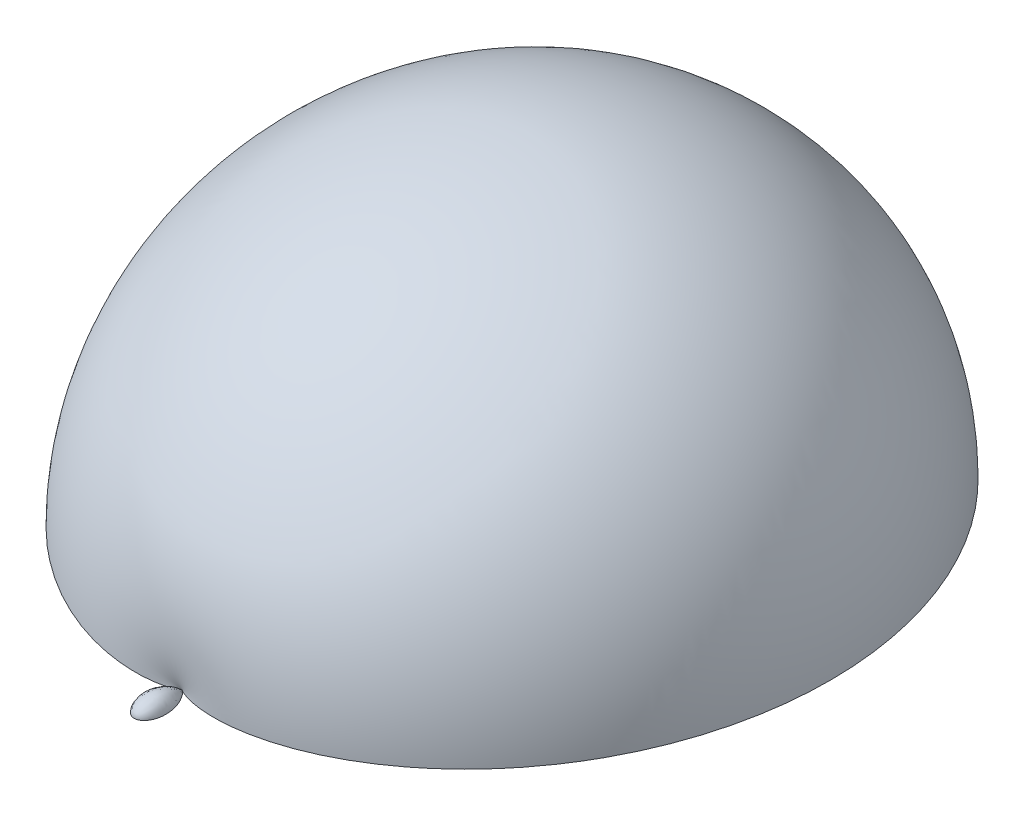
ISO-10303-21;
HEADER;
FILE_DESCRIPTION(('STEP AP214'),'2;1');
FILE_NAME('part.step','',(''),(''),'','','');
FILE_SCHEMA(('AUTOMOTIVE_DESIGN { 1 0 10303 214 1 1 1 1 }'));
ENDSEC;
DATA;
#1=APPLICATION_CONTEXT('core data for automotive mechanical design processes');
#2=APPLICATION_PROTOCOL_DEFINITION('international standard','automotive_design',2000,#1);
#3=PRODUCT_CONTEXT('',#1,'mechanical');
#4=PRODUCT('Part','Part','',(#3));
#5=PRODUCT_RELATED_PRODUCT_CATEGORY('part','',(#4));
#6=PRODUCT_DEFINITION_FORMATION('','',#4);
#7=PRODUCT_DEFINITION_CONTEXT('part definition',#1,'design');
#8=PRODUCT_DEFINITION('design','',#6,#7);
#9=PRODUCT_DEFINITION_SHAPE('','',#8);
#10=(LENGTH_UNIT() NAMED_UNIT(*) SI_UNIT(.MILLI.,.METRE.));
#11=(NAMED_UNIT(*) PLANE_ANGLE_UNIT() SI_UNIT($,.RADIAN.));
#12=(NAMED_UNIT(*) SI_UNIT($,.STERADIAN.) SOLID_ANGLE_UNIT());
#13=UNCERTAINTY_MEASURE_WITH_UNIT(LENGTH_MEASURE(1.E-05),#10,'distance_accuracy_value','');
#14=(GEOMETRIC_REPRESENTATION_CONTEXT(3) GLOBAL_UNCERTAINTY_ASSIGNED_CONTEXT((#13)) GLOBAL_UNIT_ASSIGNED_CONTEXT((#10,
#11,#12)) REPRESENTATION_CONTEXT('',''));
#15=CARTESIAN_POINT('',(0.,0.,0.));
#16=DIRECTION('',(0.,0.,1.));
#17=DIRECTION('',(1.,0.,0.));
#18=AXIS2_PLACEMENT_3D('',#15,#16,#17);
#19=CARTESIAN_POINT('',(3.06028735858265E-13,0.,21.3227192364473));
#20=CARTESIAN_POINT('',(-0.0605600851372698,0.,21.3227192364473));
#21=CARTESIAN_POINT('',(-0.180524470848123,0.,21.3196416488283));
#22=CARTESIAN_POINT('',(-0.367253435553289,0.,21.3081007327531));
#23=CARTESIAN_POINT('',(-0.555099954305753,0.,21.2828538482068));
#24=CARTESIAN_POINT('',(-0.716031376089089,0.,21.2543544839529));
#25=CARTESIAN_POINT('',(-0.844484831998398,0.,21.2271460866288));
#26=CARTESIAN_POINT('',(-1.00384668062234,0.,21.1877226172179));
#27=CARTESIAN_POINT('',(-1.19225597834348,0.,21.1319306277739));
#28=CARTESIAN_POINT('',(-1.40986644893566,0.,21.0543856421346));
#29=CARTESIAN_POINT('',(-1.65358201661449,0.,20.9495379866468));
#30=CARTESIAN_POINT('',(-1.91954629545271,0.,20.8149898556674));
#31=CARTESIAN_POINT('',(-2.20381439490061,0.,20.6455348772837));
#32=CARTESIAN_POINT('',(-2.50037552064583,0.,20.4374653876274));
#33=CARTESIAN_POINT('',(-2.80407151518409,0.,20.187245640245));
#34=CARTESIAN_POINT('',(-3.16020470363246,0.,19.8480703849216));
#35=CARTESIAN_POINT('',(-3.55002285408261,0.,19.404299117935));
#36=CARTESIAN_POINT('',(-3.95126616854423,0.,18.8437311144077));
#37=CARTESIAN_POINT('',(-4.43664961336897,0.,17.9905573006489));
#38=CARTESIAN_POINT('',(-4.89148726452149,0.,16.9017870305576));
#39=CARTESIAN_POINT('',(-5.25626167174152,0.,15.5734800440547));
#40=CARTESIAN_POINT('',(-5.47630484215257,0.,14.0155820653388));
#41=CARTESIAN_POINT('',(-5.52275474623004,0.,12.4409072350932));
#42=CARTESIAN_POINT('',(-5.41325463368996,0.,10.8698472301707));
#43=CARTESIAN_POINT('',(-5.1614088415779,0.,9.31556741862959));
#44=CARTESIAN_POINT('',(-4.777436955626,0.,7.78873548428225));
#45=CARTESIAN_POINT('',(-4.26875583085814,0.,6.29890695017353));
#46=CARTESIAN_POINT('',(-3.64033929904608,0.,4.85548320022228));
#47=CARTESIAN_POINT('',(-2.89456999099136,0.,3.46893515665885));
#48=CARTESIAN_POINT('',(-2.14256222285628,0.,2.32283287604823));
#49=CARTESIAN_POINT('',(-1.42614440038181,0.,1.40222976444919));
#50=CARTESIAN_POINT('',(-0.851142921162116,0.,0.768816275465535));
#51=CARTESIAN_POINT('',(-0.462580630449086,0.,0.387077097571633));
#52=CARTESIAN_POINT('',(-0.195923126656698,0.,0.152384324671856));
#53=CARTESIAN_POINT('',(-0.0663117351554884,0.,0.0495330631106812));
#54=CARTESIAN_POINT('',(0.,0.,0.));
#55=B_SPLINE_CURVE_WITH_KNOTS('',4,(#19,#20,#21,#22,#23,#24,#25,#26,#27,#28,#29,#30,#31,#32,#33,
#34,#35,#36,#37,#38,#39,#40,#41,#42,#43,#44,#45,#46,#47,#48,#49,#50,#51,#52,#53,#54),
.UNSPECIFIED.,.F.,.F.,(5,1,1,1,1,1,1,1,1,1,1,1,1,1,1,1,1,1,1,1,1,1,1,1,1,1,1,1,1,1,1,1,5),
(0.075727273648214,0.0852251902132587,0.0947231067783033,0.0994720692332456,0.104221031688188,
0.10896999414313,0.113718956598072,0.123216879822465,0.132714803046858,0.142432647675104,
0.15215049230335,0.166397447324557,0.180644402345764,0.194891233087148,0.209138063828531,
0.237631810695735,0.266125767747669,0.294619399363612,0.351197461360832,0.408185109509772,
0.465172649296407,0.522160251464682,0.579147822960017,0.636135418479735,0.693122967885307,
0.750110545802865,0.807098279092534,0.864085824216971,0.921073538054691,0.948543207210811,
0.97601287636693,0.988006438183465,1.),.UNSPECIFIED.);
#56=CARTESIAN_POINT('',(0.,0.,0.));
#57=DIRECTION('',(0.,0.,-1.));
#58=AXIS1_PLACEMENT('',#56,#57);
#59=SURFACE_OF_REVOLUTION('',#55,#58);
#60=CARTESIAN_POINT('',(-1.59744263229573E-13,0.,21.3227192364473));
#61=CARTESIAN_POINT('',(0.0605600851374161,0.,21.3227192364473));
#62=CARTESIAN_POINT('',(0.18052447084827,0.,21.3196416488283));
#63=CARTESIAN_POINT('',(0.367253435553436,0.,21.3081007327531));
#64=CARTESIAN_POINT('',(0.555099954305899,0.,21.2828538482068));
#65=CARTESIAN_POINT('',(0.716031376089234,0.,21.2543544839529));
#66=CARTESIAN_POINT('',(0.844484831998543,0.,21.2271460866288));
#67=CARTESIAN_POINT('',(1.00384668062249,0.,21.1877226172179));
#68=CARTESIAN_POINT('',(1.19225597834363,0.,21.1319306277738));
#69=CARTESIAN_POINT('',(1.40986644893581,0.,21.0543856421346));
#70=CARTESIAN_POINT('',(1.65358201661464,0.,20.9495379866467));
#71=CARTESIAN_POINT('',(1.91954629545285,0.,20.8149898556674));
#72=CARTESIAN_POINT('',(2.20381439490075,0.,20.6455348772837));
#73=CARTESIAN_POINT('',(2.50037552064597,0.,20.4374653876273));
#74=CARTESIAN_POINT('',(2.80407151518423,0.,20.187245640245));
#75=CARTESIAN_POINT('',(3.16020470363259,0.,19.8480703849216));
#76=CARTESIAN_POINT('',(3.55002285408275,0.,19.404299117935));
#77=CARTESIAN_POINT('',(3.95126616854436,0.,18.8437311144076));
#78=CARTESIAN_POINT('',(4.43664961336909,0.,17.9905573006488));
#79=CARTESIAN_POINT('',(4.89148726452161,0.,16.9017870305576));
#80=CARTESIAN_POINT('',(5.25626167174163,0.,15.5734800440547));
#81=CARTESIAN_POINT('',(5.47630484215267,0.,14.0155820653388));
#82=CARTESIAN_POINT('',(5.52275474623012,0.,12.4409072350931));
#83=CARTESIAN_POINT('',(5.41325463369003,0.,10.8698472301706));
#84=CARTESIAN_POINT('',(5.16140884157796,0.,9.31556741862955));
#85=CARTESIAN_POINT('',(4.77743695562606,0.,7.78873548428222));
#86=CARTESIAN_POINT('',(4.26875583085819,0.,6.2989069501735));
#87=CARTESIAN_POINT('',(3.64033929904611,0.,4.85548320022225));
#88=CARTESIAN_POINT('',(2.89456999099139,0.,3.46893515665883));
#89=CARTESIAN_POINT('',(2.1425622228563,0.,2.32283287604821));
#90=CARTESIAN_POINT('',(1.42614440038182,0.,1.40222976444918));
#91=CARTESIAN_POINT('',(0.851142921162121,0.,0.768816275465529));
#92=CARTESIAN_POINT('',(0.462580630449089,0.,0.387077097571629));
#93=CARTESIAN_POINT('',(0.195923126656699,0.,0.152384324671855));
#94=CARTESIAN_POINT('',(0.0663117351554888,0.,0.0495330631106807));
#95=CARTESIAN_POINT('',(0.,0.,0.));
#96=B_SPLINE_CURVE_WITH_KNOTS('',4,(#60,#61,#62,#63,#64,#65,#66,#67,#68,#69,#70,#71,#72,#73,#74,
#75,#76,#77,#78,#79,#80,#81,#82,#83,#84,#85,#86,#87,#88,#89,#90,#91,#92,#93,#94,#95),
.UNSPECIFIED.,.F.,.F.,(5,1,1,1,1,1,1,1,1,1,1,1,1,1,1,1,1,1,1,1,1,1,1,1,1,1,1,1,1,1,1,1,5),
(0.075727273648214,0.0852251902132587,0.0947231067783033,0.0994720692332456,0.104221031688188,
0.10896999414313,0.113718956598072,0.123216879822465,0.132714803046858,0.142432647675104,
0.15215049230335,0.166397447324557,0.180644402345764,0.194891233087148,0.209138063828531,
0.237631810695735,0.266125767747669,0.294619399363612,0.351197461360832,0.408185109509772,
0.465172649296407,0.522160251464682,0.579147822960017,0.636135418479735,0.693122967885307,
0.750110545802865,0.807098279092534,0.864085824216971,0.921073538054691,0.948543207210811,
0.97601287636693,0.988006438183465,1.),.UNSPECIFIED.);
#97=CARTESIAN_POINT('',(1.4497883263559E-13,0.,21.3227192364473));
#98=VERTEX_POINT('',#97);
#99=CARTESIAN_POINT('',(0.,0.,0.));
#100=VERTEX_POINT('',#99);
#101=EDGE_CURVE('P0_E27',#98,#100,#96,.T.);
#102=ORIENTED_EDGE('',*,*,#101,.T.);
#103=EDGE_CURVE('P0_E11',#98,#100,#55,.T.);
#104=ORIENTED_EDGE('',*,*,#103,.F.);
#105=EDGE_LOOP('',(#102,#104));
#106=FACE_BOUND('',#105,.T.);
#107=ADVANCED_FACE('P0_F17',(#106),#59,.T.);
#108=CARTESIAN_POINT('',(-5.42041091230144,0.,11.2243457893201));
#109=DIRECTION('',(0.,1.,0.));
#110=DIRECTION('',(0.,0.,-1.));
#111=AXIS2_PLACEMENT_3D('',#108,#109,#110);
#112=PLANE('',#111);
#113=ORIENTED_EDGE('',*,*,#103,.T.);
#114=ORIENTED_EDGE('',*,*,#101,.F.);
#115=EDGE_LOOP('',(#113,#114));
#116=FACE_BOUND('',#115,.T.);
#117=ADVANCED_FACE('P0_F34',(#116),#112,.F.);
#118=CLOSED_SHELL('',(#107,#117));
#119=MANIFOLD_SOLID_BREP('P0_B1',#118);
#120=CARTESIAN_POINT('',(2.07386554913813E-12,0.,0.));
#121=CARTESIAN_POINT('',(-0.0479863208393457,0.,0.0321703262097624));
#122=CARTESIAN_POINT('',(-0.145134861787362,0.,0.0946417333582184));
#123=CARTESIAN_POINT('',(-0.344202177756289,0.,0.212012112728412));
#124=CARTESIAN_POINT('',(-0.649410607301891,0.,0.376321721449868));
#125=CARTESIAN_POINT('',(-1.01178827318737,0.,0.555730005310857));
#126=CARTESIAN_POINT('',(-1.43242484901607,0.,0.747093766717329));
#127=CARTESIAN_POINT('',(-1.8580310883749,0.,0.927038839520863));
#128=CARTESIAN_POINT('',(-2.39525808021264,0.,1.1392078014803));
#129=CARTESIAN_POINT('',(-3.05778948779468,0.,1.3793736094263));
#130=CARTESIAN_POINT('',(-3.84838735570272,0.,1.63802458522609));
#131=CARTESIAN_POINT('',(-5.00215548509229,0.,1.97326411091218));
#132=CARTESIAN_POINT('',(-6.41543920888815,0.,2.32276693782154));
#133=CARTESIAN_POINT('',(-8.08061631008433,0.,2.65812280227645));
#134=CARTESIAN_POINT('',(-10.0715697689984,0.,2.96538096190314));
#135=CARTESIAN_POINT('',(-12.1467731358893,0.,3.19521110168923));
#136=CARTESIAN_POINT('',(-14.3027932474081,0.,3.345727050951));
#137=CARTESIAN_POINT('',(-16.5362981719592,-1.1547235296189E-13,3.41472517118743));
#138=CARTESIAN_POINT('',(-19.7079432041989,-1.37619831848889E-13,3.39857422575522));
#139=CARTESIAN_POINT('',(-23.0648185664982,-1.6106076721747E-13,3.20532305357224));
#140=CARTESIAN_POINT('',(-26.59557673471,-1.85715919730028E-13,2.82286693544886));
#141=CARTESIAN_POINT('',(-30.2890453566026,-2.1150727326791E-13,2.23743411660248));
#142=CARTESIAN_POINT('',(-33.2255239502246,-2.32012593690997E-13,1.66595198747096));
#143=CARTESIAN_POINT('',(-36.8702423586542,-2.57463526307737E-13,0.829296860920982));
#144=CARTESIAN_POINT('',(-41.1979321500885,-2.87683622601926E-13,-0.360314402722459));
#145=CARTESIAN_POINT('',(-46.1718067459134,-3.22416003268063E-13,-2.00056274204736));
#146=CARTESIAN_POINT('',(-53.2002912903775,-3.71495648522751E-13,-4.76669159526652));
#147=CARTESIAN_POINT('',(-64.0662718649665,-4.4737238533157E-13,-9.97458895910713));
#148=CARTESIAN_POINT('',(-78.0879986462571,-5.45285580122036E-13,-18.8247698956133));
#149=CARTESIAN_POINT('',(-94.0780397445643,-6.56943440326184E-13,-32.6027109217908));
#150=CARTESIAN_POINT('',(-109.522130393088,-7.6478894891563E-13,-51.0060171862142));
#151=CARTESIAN_POINT('',(-121.993292050705,-8.51874605318156E-13,-71.5305091027313));
#152=CARTESIAN_POINT('',(-130.15814508519,-9.08889469326759E-13,-90.8896994358743));
#153=CARTESIAN_POINT('',(-135.10771528345,-9.434521332918E-13,-108.176937844795));
#154=CARTESIAN_POINT('',(-138.376785104317,-9.66279925841665E-13,-125.838291985251));
#155=CARTESIAN_POINT('',(-139.680812788272,-9.75385902489389E-13,-140.76642516533));
#156=CARTESIAN_POINT('',(-139.53990217952,-9.74401928967587E-13,-155.751586100403));
#157=CARTESIAN_POINT('',(-137.941693761858,-9.63241699235888E-13,-170.634378490997));
#158=CARTESIAN_POINT('',(-135.786987086062,-9.48195462937439E-13,-182.413843163642));
#159=CARTESIAN_POINT('',(-132.757744461827,-9.27042374750749E-13,-193.999573998504));
#160=CARTESIAN_POINT('',(-128.859639270352,-8.99822051684984E-13,-205.322900290727));
#161=CARTESIAN_POINT('',(-124.102852164729,-8.66605584860722E-13,-216.313556294855));
#162=CARTESIAN_POINT('',(-118.502761106392,-8.27500358008706E-13,-226.89985439899));
#163=CARTESIAN_POINT('',(-112.080527474755,-7.82654140251605E-13,-237.009041725339));
#164=CARTESIAN_POINT('',(-104.863770349494,-7.32259794591979E-13,-246.567787483469));
#165=CARTESIAN_POINT('',(-96.8871562187137,-6.76559395822438E-13,-255.502869604249));
#166=CARTESIAN_POINT('',(-88.192954370992,-6.15848108807526E-13,-263.742039758038));
#167=CARTESIAN_POINT('',(-80.0016390851504,-5.58648459885333E-13,-270.280947104679));
#168=CARTESIAN_POINT('',(-72.6000508032795,-5.06963445157428E-13,-275.365034326222));
#169=CARTESIAN_POINT('',(-66.1992969321918,-4.62267219766567E-13,-279.23517287352));
#170=CARTESIAN_POINT('',(-60.9479068793383,-4.25596959021518E-13,-282.103901172911));
#171=CARTESIAN_POINT('',(-55.5750626208033,-3.88078588091147E-13,-284.738225891423));
#172=CARTESIAN_POINT('',(-50.0906272085948,-3.49780980299514E-13,-287.131575809175));
#173=CARTESIAN_POINT('',(-44.5048242990486,-3.10775527057241E-13,-289.277874601187));
#174=CARTESIAN_POINT('',(-38.828450490917,-2.71137620610462E-13,-291.171584885398));
#175=CARTESIAN_POINT('',(-33.0724414368496,-2.30943624213486E-13,-292.807749888578));
#176=CARTESIAN_POINT('',(-27.2485048282709,-1.9027529223857E-13,-294.182032130039));
#177=CARTESIAN_POINT('',(-22.1029726390701,-1.54344233004547E-13,-295.152158828091));
#178=CARTESIAN_POINT('',(-18.0350942367525,-1.25938389943798E-13,-295.760536134997));
#179=CARTESIAN_POINT('',(-15.065690799796,-1.05203156568537E-13,-296.124160412145));
#180=CARTESIAN_POINT('',(-13.2078311469778,0.,-296.323196206307));
#181=CARTESIAN_POINT('',(-11.7170445283904,0.,-296.465459961173));
#182=CARTESIAN_POINT('',(-10.2307831062727,0.,-296.590734539412));
#183=CARTESIAN_POINT('',(-8.73230350409256,0.,-296.698998443845));
#184=CARTESIAN_POINT('',(-7.21850583353519,0.,-296.792207093271));
#185=CARTESIAN_POINT('',(-5.64317292437778,0.,-296.869094234134));
#186=CARTESIAN_POINT('',(-4.07854022025919,0.,-296.928362498182));
#187=CARTESIAN_POINT('',(-2.61412262196324,0.,-296.96364404572));
#188=CARTESIAN_POINT('',(-1.46310281447096,0.,-296.981286093145));
#189=CARTESIAN_POINT('',(-0.559088915756624,0.,-296.986326825011));
#190=CARTESIAN_POINT('',(-0.184648694079104,0.,-296.987166947344));
#191=CARTESIAN_POINT('',(1.62589145400589E-10,0.,-296.987166947343));
#192=B_SPLINE_CURVE_WITH_KNOTS('',4,(#120,#121,#122,#123,#124,#125,#126,#127,#128,#129,#130,
#131,#132,#133,#134,#135,#136,#137,#138,#139,#140,#141,#142,#143,#144,#145,#146,#147,#148,#149,
#150,#151,#152,#153,#154,#155,#156,#157,#158,#159,#160,#161,#162,#163,#164,#165,#166,#167,#168,
#169,#170,#171,#172,#173,#174,#175,#176,#177,#178,#179,#180,#181,#182,#183,#184,#185,#186,#187,
#188,#189,#190,#191),.UNSPECIFIED.,.F.,.F.,(5,1,1,1,1,1,1,1,1,1,1,1,1,1,1,1,1,1,1,1,1,1,1,1,1,1,
1,1,1,1,1,1,1,1,1,1,1,1,1,1,1,1,1,1,1,1,1,1,1,1,1,1,1,1,1,1,1,1,1,1,1,1,1,1,1,1,1,1,5),(0.,
0.000458674137903002,0.000917348275806004,0.00183469655161201,0.00275204482741801,
0.00366939310322401,0.00458674137903002,0.00550408965483602,0.00733878620644803,
0.00926515636266851,0.011191526518889,0.01504426683133,0.0188970071437709,0.0227497474562119,
0.0271852996393439,0.0316208518224759,0.0360564040056079,0.0404919561887399,0.0523686588342327,
0.0583070101569791,0.0642453614797256,0.0701838779914301,0.0761223945031346,0.0879994275265436,
0.0998762104815178,0.111752993436492,0.136078927552254,0.183585527710117,0.231092168472181,
0.278599012887844,0.326105735545153,0.373612429891048,0.3973658263705,0.421119222849953,
0.468625937647202,0.492379295105644,0.516132652564086,0.539886019817049,0.563639387070011,
0.587392748350968,0.611146109631925,0.634899475453517,0.658652841275109,0.682406203776029,
0.706159566276949,0.7299129268991,0.753666287521252,0.765542968356271,0.777419649191289,
0.789296330026308,0.801173010861327,0.81304968982068,0.824926368780033,0.836803047739386,
0.848679726698739,0.860556404824788,0.872433082950836,0.87837142201386,0.881340591545372,
0.884309761076884,0.887278930608396,0.890248100139908,0.89321726967142,0.896186439202932,
0.899412568707219,0.902638698211505,0.905864827715792,0.907477892467935,0.909090957220078),.UNSPECIFIED.);
#193=CARTESIAN_POINT('',(0.,0.,-296.987166947343));
#194=DIRECTION('',(0.,0.,-1.));
#195=AXIS1_PLACEMENT('',#193,#194);
#196=SURFACE_OF_REVOLUTION('',#192,#195);
#197=CARTESIAN_POINT('',(0.,0.,0.));
#198=CARTESIAN_POINT('',(0.0479863208414198,0.,0.0321703262097621));
#199=CARTESIAN_POINT('',(0.145134861789436,0.,0.0946417333582174));
#200=CARTESIAN_POINT('',(0.344202177758364,0.,0.21201211272841));
#201=CARTESIAN_POINT('',(0.649410607303967,0.,0.376321721449864));
#202=CARTESIAN_POINT('',(1.01178827318945,0.,0.55573000531085));
#203=CARTESIAN_POINT('',(1.43242484901815,0.,0.747093766717319));
#204=CARTESIAN_POINT('',(1.85803108837698,0.,0.92703883952085));
#205=CARTESIAN_POINT('',(2.39525808021472,0.,1.13920780148028));
#206=CARTESIAN_POINT('',(3.05778948779677,0.,1.37937360942628));
#207=CARTESIAN_POINT('',(3.8483873557048,0.,1.63802458522606));
#208=CARTESIAN_POINT('',(5.00215548509438,0.,1.97326411091214));
#209=CARTESIAN_POINT('',(6.41543920889024,0.,2.32276693782149));
#210=CARTESIAN_POINT('',(8.08061631008642,0.,2.6581228022764));
#211=CARTESIAN_POINT('',(10.0715697690005,0.,2.96538096190307));
#212=CARTESIAN_POINT('',(12.1467731358914,0.,3.19521110168914));
#213=CARTESIAN_POINT('',(14.3027932474102,0.,3.3457270509509));
#214=CARTESIAN_POINT('',(16.5362981719613,0.,3.41472517118732));
#215=CARTESIAN_POINT('',(19.707943204201,0.,3.39857422575509));
#216=CARTESIAN_POINT('',(23.0648185665003,0.,3.20532305357208));
#217=CARTESIAN_POINT('',(26.5955767347121,0.,2.82286693544867));
#218=CARTESIAN_POINT('',(30.2890453566047,0.,2.23743411660227));
#219=CARTESIAN_POINT('',(33.2255239502267,0.,1.66595198747073));
#220=CARTESIAN_POINT('',(36.8702423586563,0.,0.829296860920729));
#221=CARTESIAN_POINT('',(41.1979321500905,0.,-0.360314402722741));
#222=CARTESIAN_POINT('',(46.1718067459154,0.,-2.00056274204767));
#223=CARTESIAN_POINT('',(53.2002912903795,0.,-4.76669159526689));
#224=CARTESIAN_POINT('',(64.0662718649685,0.,-9.97458895910756));
#225=CARTESIAN_POINT('',(78.087998646259,0.,-18.8247698956139));
#226=CARTESIAN_POINT('',(94.0780397445662,0.,-32.6027109217914));
#227=CARTESIAN_POINT('',(109.52213039309,0.,-51.0060171862149));
#228=CARTESIAN_POINT('',(121.993292050706,0.,-71.5305091027322));
#229=CARTESIAN_POINT('',(130.158145085191,0.,-90.8896994358752));
#230=CARTESIAN_POINT('',(135.107715283452,0.,-108.176937844796));
#231=CARTESIAN_POINT('',(138.376785104319,0.,-125.838291985251));
#232=CARTESIAN_POINT('',(139.680812788273,0.,-140.76642516533));
#233=CARTESIAN_POINT('',(139.539902179521,0.,-155.751586100404));
#234=CARTESIAN_POINT('',(137.941693761859,0.,-170.634378490998));
#235=CARTESIAN_POINT('',(135.786987086063,0.,-182.413843163642));
#236=CARTESIAN_POINT('',(132.757744461827,0.,-193.999573998505));
#237=CARTESIAN_POINT('',(128.859639270352,0.,-205.322900290728));
#238=CARTESIAN_POINT('',(124.10285216473,0.,-216.313556294856));
#239=CARTESIAN_POINT('',(118.502761106392,0.,-226.899854398991));
#240=CARTESIAN_POINT('',(112.080527474755,0.,-237.00904172534));
#241=CARTESIAN_POINT('',(104.863770349494,0.,-246.56778748347));
#242=CARTESIAN_POINT('',(96.887156218714,0.,-255.502869604249));
#243=CARTESIAN_POINT('',(88.1929543709923,0.,-263.742039758038));
#244=CARTESIAN_POINT('',(80.0016390851506,0.,-270.280947104679));
#245=CARTESIAN_POINT('',(72.6000508032797,0.,-275.365034326223));
#246=CARTESIAN_POINT('',(66.1992969321919,0.,-279.23517287352));
#247=CARTESIAN_POINT('',(60.9479068793384,0.,-282.103901172911));
#248=CARTESIAN_POINT('',(55.5750626208034,0.,-284.738225891423));
#249=CARTESIAN_POINT('',(50.0906272085949,0.,-287.131575809175));
#250=CARTESIAN_POINT('',(44.5048242990487,0.,-289.277874601188));
#251=CARTESIAN_POINT('',(38.828450490917,0.,-291.171584885399));
#252=CARTESIAN_POINT('',(33.0724414368496,0.,-292.807749888578));
#253=CARTESIAN_POINT('',(27.2485048282709,0.,-294.18203213004));
#254=CARTESIAN_POINT('',(22.1029726390701,0.,-295.152158828091));
#255=CARTESIAN_POINT('',(18.0350942367526,0.,-295.760536134997));
#256=CARTESIAN_POINT('',(15.065690799796,0.,-296.124160412145));
#257=CARTESIAN_POINT('',(13.2078311469778,0.,-296.323196206307));
#258=CARTESIAN_POINT('',(11.7170445283904,0.,-296.465459961173));
#259=CARTESIAN_POINT('',(10.2307831062727,0.,-296.590734539412));
#260=CARTESIAN_POINT('',(8.7323035040926,0.,-296.698998443845));
#261=CARTESIAN_POINT('',(7.21850583353523,0.,-296.792207093271));
#262=CARTESIAN_POINT('',(5.64317292437782,0.,-296.869094234134));
#263=CARTESIAN_POINT('',(4.07854022025923,0.,-296.928362498182));
#264=CARTESIAN_POINT('',(2.61412262196328,0.,-296.96364404572));
#265=CARTESIAN_POINT('',(1.46310281447099,0.,-296.981286093145));
#266=CARTESIAN_POINT('',(0.559088915756661,0.,-296.986326825011));
#267=CARTESIAN_POINT('',(0.18464869407914,0.,-296.987166947344));
#268=CARTESIAN_POINT('',(-1.6255277496225E-10,0.,-296.987166947343));
#269=B_SPLINE_CURVE_WITH_KNOTS('',4,(#197,#198,#199,#200,#201,#202,#203,#204,#205,#206,#207,
#208,#209,#210,#211,#212,#213,#214,#215,#216,#217,#218,#219,#220,#221,#222,#223,#224,#225,#226,
#227,#228,#229,#230,#231,#232,#233,#234,#235,#236,#237,#238,#239,#240,#241,#242,#243,#244,#245,
#246,#247,#248,#249,#250,#251,#252,#253,#254,#255,#256,#257,#258,#259,#260,#261,#262,#263,#264,
#265,#266,#267,#268),.UNSPECIFIED.,.F.,.F.,(5,1,1,1,1,1,1,1,1,1,1,1,1,1,1,1,1,1,1,1,1,1,1,1,1,1,
1,1,1,1,1,1,1,1,1,1,1,1,1,1,1,1,1,1,1,1,1,1,1,1,1,1,1,1,1,1,1,1,1,1,1,1,1,1,1,1,1,1,5),(0.,
0.000458674137903002,0.000917348275806004,0.00183469655161201,0.00275204482741801,
0.00366939310322401,0.00458674137903002,0.00550408965483602,0.00733878620644803,
0.00926515636266851,0.011191526518889,0.01504426683133,0.0188970071437709,0.0227497474562119,
0.0271852996393439,0.0316208518224759,0.0360564040056079,0.0404919561887399,0.0523686588342327,
0.0583070101569791,0.0642453614797256,0.0701838779914301,0.0761223945031346,0.0879994275265436,
0.0998762104815178,0.111752993436492,0.136078927552254,0.183585527710117,0.231092168472181,
0.278599012887844,0.326105735545153,0.373612429891048,0.3973658263705,0.421119222849953,
0.468625937647202,0.492379295105644,0.516132652564086,0.539886019817049,0.563639387070011,
0.587392748350968,0.611146109631925,0.634899475453517,0.658652841275109,0.682406203776029,
0.706159566276949,0.7299129268991,0.753666287521252,0.765542968356271,0.777419649191289,
0.789296330026308,0.801173010861327,0.81304968982068,0.824926368780033,0.836803047739386,
0.848679726698739,0.860556404824788,0.872433082950836,0.87837142201386,0.881340591545372,
0.884309761076884,0.887278930608396,0.890248100139908,0.89321726967142,0.896186439202932,
0.899412568707219,0.902638698211505,0.905864827715792,0.907477892467935,0.909090957220078),.UNSPECIFIED.);
#270=CARTESIAN_POINT('',(2.07385030254508E-12,0.,0.));
#271=VERTEX_POINT('',#270);
#272=CARTESIAN_POINT('',(0.,0.,-296.987166947343));
#273=VERTEX_POINT('',#272);
#274=EDGE_CURVE('P1_E26',#271,#273,#269,.T.);
#275=ORIENTED_EDGE('',*,*,#274,.T.);
#276=EDGE_CURVE('P1_E10',#271,#273,#192,.T.);
#277=ORIENTED_EDGE('',*,*,#276,.F.);
#278=EDGE_LOOP('',(#275,#277));
#279=FACE_BOUND('',#278,.T.);
#280=ADVANCED_FACE('P1_F16',(#279),#196,.T.);
#281=CARTESIAN_POINT('',(-139.436774557706,-9.73681792633416E-13,-145.65101687425));
#282=DIRECTION('',(0.,1.,0.));
#283=DIRECTION('',(0.,0.,-1.));
#284=AXIS2_PLACEMENT_3D('',#281,#282,#283);
#285=PLANE('',#284);
#286=ORIENTED_EDGE('',*,*,#276,.T.);
#287=ORIENTED_EDGE('',*,*,#274,.F.);
#288=EDGE_LOOP('',(#286,#287));
#289=FACE_BOUND('',#288,.T.);
#290=ADVANCED_FACE('P1_F33',(#289),#285,.F.);
#291=CLOSED_SHELL('',(#280,#290));
#292=MANIFOLD_SOLID_BREP('P1_B1',#291);
#293=ADVANCED_BREP_SHAPE_REPRESENTATION('',(#18,#119,#292),#14);
#294=SHAPE_DEFINITION_REPRESENTATION(#9,#293);
ENDSEC;
END-ISO-10303-21;
